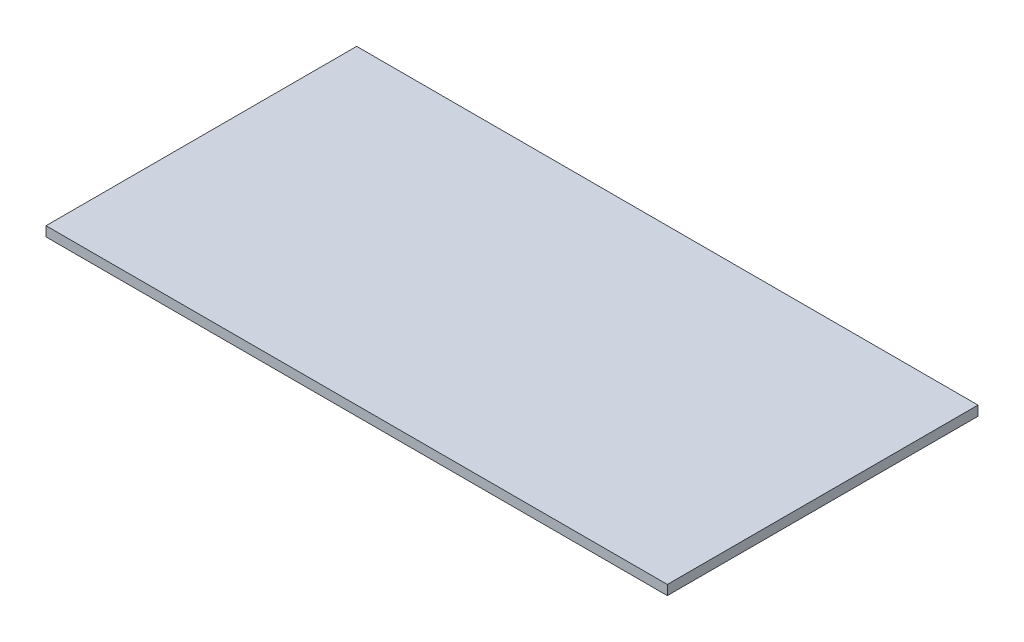
ISO-10303-21;
HEADER;
FILE_DESCRIPTION(('STEP AP214'),'2;1');
FILE_NAME('part.step','',(''),(''),'','','');
FILE_SCHEMA(('AUTOMOTIVE_DESIGN { 1 0 10303 214 1 1 1 1 }'));
ENDSEC;
DATA;
#1=APPLICATION_CONTEXT('core data for automotive mechanical design processes');
#2=APPLICATION_PROTOCOL_DEFINITION('international standard','automotive_design',2000,#1);
#3=PRODUCT_CONTEXT('',#1,'mechanical');
#4=PRODUCT('Part','Part','',(#3));
#5=PRODUCT_RELATED_PRODUCT_CATEGORY('part','',(#4));
#6=PRODUCT_DEFINITION_FORMATION('','',#4);
#7=PRODUCT_DEFINITION_CONTEXT('part definition',#1,'design');
#8=PRODUCT_DEFINITION('design','',#6,#7);
#9=PRODUCT_DEFINITION_SHAPE('','',#8);
#10=(LENGTH_UNIT() NAMED_UNIT(*) SI_UNIT(.MILLI.,.METRE.));
#11=(NAMED_UNIT(*) PLANE_ANGLE_UNIT() SI_UNIT($,.RADIAN.));
#12=(NAMED_UNIT(*) SI_UNIT($,.STERADIAN.) SOLID_ANGLE_UNIT());
#13=UNCERTAINTY_MEASURE_WITH_UNIT(LENGTH_MEASURE(1.E-05),#10,'distance_accuracy_value','');
#14=(GEOMETRIC_REPRESENTATION_CONTEXT(3) GLOBAL_UNCERTAINTY_ASSIGNED_CONTEXT((#13)) GLOBAL_UNIT_ASSIGNED_CONTEXT((#10,
#11,#12)) REPRESENTATION_CONTEXT('',''));
#15=CARTESIAN_POINT('',(0.,0.,0.));
#16=DIRECTION('',(0.,0.,1.));
#17=DIRECTION('',(1.,0.,0.));
#18=AXIS2_PLACEMENT_3D('',#15,#16,#17);
#19=CARTESIAN_POINT('',(-59.1289481870499,4.7625,-123.999481579448));
#20=DIRECTION('',(1.,0.,0.));
#21=DIRECTION('',(0.,0.,-1.));
#22=AXIS2_PLACEMENT_3D('',#19,#20,#21);
#23=PLANE('',#22);
#24=DIRECTION('',(0.,0.,1.));
#25=VECTOR('',#24,1.);
#26=CARTESIAN_POINT('',(-59.1289481870499,0.,-123.999481579448));
#27=LINE('',#26,#25);
#28=CARTESIAN_POINT('',(-59.1289481870499,0.,-123.999481579448));
#29=VERTEX_POINT('',#28);
#30=CARTESIAN_POINT('',(-59.1289481870498,0.,28.4005184205515));
#31=VERTEX_POINT('',#30);
#32=EDGE_CURVE('E98',#29,#31,#27,.T.);
#33=ORIENTED_EDGE('',*,*,#32,.T.);
#34=DIRECTION('',(0.,-1.,0.));
#35=VECTOR('',#34,1.);
#36=CARTESIAN_POINT('',(-59.1289481870498,4.7625,28.4005184205515));
#37=LINE('',#36,#35);
#38=CARTESIAN_POINT('',(-59.1289481870498,4.7625,28.4005184205515));
#39=VERTEX_POINT('',#38);
#40=EDGE_CURVE('E11',#39,#31,#37,.T.);
#41=ORIENTED_EDGE('',*,*,#40,.F.);
#42=DIRECTION('',(0.,0.,1.));
#43=VECTOR('',#42,1.);
#44=CARTESIAN_POINT('',(-59.1289481870499,4.7625,-123.999481579448));
#45=LINE('',#44,#43);
#46=CARTESIAN_POINT('',(-59.1289481870499,4.7625,-123.999481579448));
#47=VERTEX_POINT('',#46);
#48=EDGE_CURVE('E86',#47,#39,#45,.T.);
#49=ORIENTED_EDGE('',*,*,#48,.F.);
#50=DIRECTION('',(0.,-1.,0.));
#51=VECTOR('',#50,1.);
#52=CARTESIAN_POINT('',(-59.1289481870499,4.7625,-123.999481579448));
#53=LINE('',#52,#51);
#54=EDGE_CURVE('E94',#47,#29,#53,.T.);
#55=ORIENTED_EDGE('',*,*,#54,.T.);
#56=EDGE_LOOP('',(#33,#41,#49,#55));
#57=FACE_BOUND('',#56,.T.);
#58=ADVANCED_FACE('F35',(#57),#23,.F.);
#59=CARTESIAN_POINT('',(-59.1289481870498,4.7625,28.4005184205515));
#60=DIRECTION('',(0.,0.,-1.));
#61=DIRECTION('',(-1.,0.,0.));
#62=AXIS2_PLACEMENT_3D('',#59,#60,#61);
#63=PLANE('',#62);
#64=DIRECTION('',(1.,0.,0.));
#65=VECTOR('',#64,1.);
#66=CARTESIAN_POINT('',(-59.1289481870498,0.,28.4005184205515));
#67=LINE('',#66,#65);
#68=CARTESIAN_POINT('',(245.67105181295,0.,28.4005184205515));
#69=VERTEX_POINT('',#68);
#70=EDGE_CURVE('E90',#31,#69,#67,.T.);
#71=ORIENTED_EDGE('',*,*,#70,.T.);
#72=DIRECTION('',(0.,-1.,0.));
#73=VECTOR('',#72,1.);
#74=CARTESIAN_POINT('',(245.67105181295,4.7625,28.4005184205515));
#75=LINE('',#74,#73);
#76=CARTESIAN_POINT('',(245.67105181295,4.7625,28.4005184205515));
#77=VERTEX_POINT('',#76);
#78=EDGE_CURVE('E43',#77,#69,#75,.T.);
#79=ORIENTED_EDGE('',*,*,#78,.F.);
#80=DIRECTION('',(1.,0.,0.));
#81=VECTOR('',#80,1.);
#82=CARTESIAN_POINT('',(-59.1289481870498,4.7625,28.4005184205515));
#83=LINE('',#82,#81);
#84=EDGE_CURVE('E81',#39,#77,#83,.T.);
#85=ORIENTED_EDGE('',*,*,#84,.F.);
#86=ORIENTED_EDGE('',*,*,#40,.T.);
#87=EDGE_LOOP('',(#71,#79,#85,#86));
#88=FACE_BOUND('',#87,.T.);
#89=ADVANCED_FACE('F89',(#88),#63,.F.);
#90=CARTESIAN_POINT('',(245.67105181295,4.7625,-123.999481579448));
#91=DIRECTION('',(-1.,0.,0.));
#92=DIRECTION('',(0.,0.,1.));
#93=AXIS2_PLACEMENT_3D('',#90,#91,#92);
#94=PLANE('',#93);
#95=DIRECTION('',(0.,0.,-1.));
#96=VECTOR('',#95,1.);
#97=CARTESIAN_POINT('',(245.67105181295,0.,-123.999481579448));
#98=LINE('',#97,#96);
#99=CARTESIAN_POINT('',(245.67105181295,0.,-123.999481579448));
#100=VERTEX_POINT('',#99);
#101=EDGE_CURVE('E68',#69,#100,#98,.T.);
#102=ORIENTED_EDGE('',*,*,#101,.T.);
#103=DIRECTION('',(0.,-1.,0.));
#104=VECTOR('',#103,1.);
#105=CARTESIAN_POINT('',(245.67105181295,4.7625,-123.999481579448));
#106=LINE('',#105,#104);
#107=CARTESIAN_POINT('',(245.67105181295,4.7625,-123.999481579448));
#108=VERTEX_POINT('',#107);
#109=EDGE_CURVE('E91',#108,#100,#106,.T.);
#110=ORIENTED_EDGE('',*,*,#109,.F.);
#111=DIRECTION('',(0.,0.,-1.));
#112=VECTOR('',#111,1.);
#113=CARTESIAN_POINT('',(245.67105181295,4.7625,-123.999481579448));
#114=LINE('',#113,#112);
#115=EDGE_CURVE('E84',#77,#108,#114,.T.);
#116=ORIENTED_EDGE('',*,*,#115,.F.);
#117=ORIENTED_EDGE('',*,*,#78,.T.);
#118=EDGE_LOOP('',(#102,#110,#116,#117));
#119=FACE_BOUND('',#118,.T.);
#120=ADVANCED_FACE('F92',(#119),#94,.F.);
#121=CARTESIAN_POINT('',(-59.1289481870499,4.7625,-123.999481579448));
#122=DIRECTION('',(0.,0.,1.));
#123=DIRECTION('',(1.,0.,0.));
#124=AXIS2_PLACEMENT_3D('',#121,#122,#123);
#125=PLANE('',#124);
#126=DIRECTION('',(-1.,0.,0.));
#127=VECTOR('',#126,1.);
#128=CARTESIAN_POINT('',(-59.1289481870499,0.,-123.999481579448));
#129=LINE('',#128,#127);
#130=EDGE_CURVE('E74',#100,#29,#129,.T.);
#131=ORIENTED_EDGE('',*,*,#130,.T.);
#132=ORIENTED_EDGE('',*,*,#54,.F.);
#133=DIRECTION('',(-1.,0.,0.));
#134=VECTOR('',#133,1.);
#135=CARTESIAN_POINT('',(-59.1289481870499,4.7625,-123.999481579448));
#136=LINE('',#135,#134);
#137=EDGE_CURVE('E51',#108,#47,#136,.T.);
#138=ORIENTED_EDGE('',*,*,#137,.F.);
#139=ORIENTED_EDGE('',*,*,#109,.T.);
#140=EDGE_LOOP('',(#131,#132,#138,#139));
#141=FACE_BOUND('',#140,.T.);
#142=ADVANCED_FACE('F105',(#141),#125,.F.);
#143=CARTESIAN_POINT('',(0.,4.7625,0.));
#144=DIRECTION('',(0.,1.,0.));
#145=DIRECTION('',(0.,0.,1.));
#146=AXIS2_PLACEMENT_3D('',#143,#144,#145);
#147=PLANE('',#146);
#148=ORIENTED_EDGE('',*,*,#48,.T.);
#149=ORIENTED_EDGE('',*,*,#84,.T.);
#150=ORIENTED_EDGE('',*,*,#115,.T.);
#151=ORIENTED_EDGE('',*,*,#137,.T.);
#152=EDGE_LOOP('',(#148,#149,#150,#151));
#153=FACE_BOUND('',#152,.T.);
#154=ADVANCED_FACE('F82',(#153),#147,.T.);
#155=CARTESIAN_POINT('',(0.,0.,0.));
#156=DIRECTION('',(0.,1.,0.));
#157=DIRECTION('',(0.,0.,1.));
#158=AXIS2_PLACEMENT_3D('',#155,#156,#157);
#159=PLANE('',#158);
#160=ORIENTED_EDGE('',*,*,#32,.F.);
#161=ORIENTED_EDGE('',*,*,#130,.F.);
#162=ORIENTED_EDGE('',*,*,#101,.F.);
#163=ORIENTED_EDGE('',*,*,#70,.F.);
#164=EDGE_LOOP('',(#160,#161,#162,#163));
#165=FACE_BOUND('',#164,.T.);
#166=ADVANCED_FACE('F108',(#165),#159,.F.);
#167=CLOSED_SHELL('',(#58,#89,#120,#142,#154,#166));
#168=MANIFOLD_SOLID_BREP('B2',#167);
#169=ADVANCED_BREP_SHAPE_REPRESENTATION('',(#18,#168),#14);
#170=SHAPE_DEFINITION_REPRESENTATION(#9,#169);
ENDSEC;
END-ISO-10303-21;
